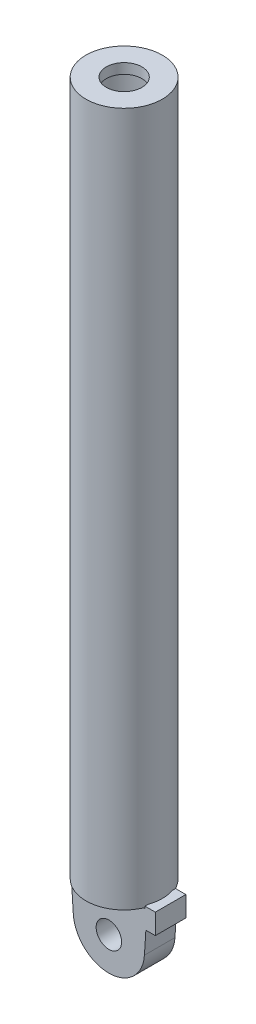
ISO-10303-21;
HEADER;
FILE_DESCRIPTION(('STEP AP214'),'2;1');
FILE_NAME('part.step','',(''),(''),'','','');
FILE_SCHEMA(('AUTOMOTIVE_DESIGN { 1 0 10303 214 1 1 1 1 }'));
ENDSEC;
DATA;
#1=APPLICATION_CONTEXT('core data for automotive mechanical design processes');
#2=APPLICATION_PROTOCOL_DEFINITION('international standard','automotive_design',2000,#1);
#3=PRODUCT_CONTEXT('',#1,'mechanical');
#4=PRODUCT('Part','Part','',(#3));
#5=PRODUCT_RELATED_PRODUCT_CATEGORY('part','',(#4));
#6=PRODUCT_DEFINITION_FORMATION('','',#4);
#7=PRODUCT_DEFINITION_CONTEXT('part definition',#1,'design');
#8=PRODUCT_DEFINITION('design','',#6,#7);
#9=PRODUCT_DEFINITION_SHAPE('','',#8);
#10=(LENGTH_UNIT() NAMED_UNIT(*) SI_UNIT(.MILLI.,.METRE.));
#11=(NAMED_UNIT(*) PLANE_ANGLE_UNIT() SI_UNIT($,.RADIAN.));
#12=(NAMED_UNIT(*) SI_UNIT($,.STERADIAN.) SOLID_ANGLE_UNIT());
#13=UNCERTAINTY_MEASURE_WITH_UNIT(LENGTH_MEASURE(1.E-05),#10,'distance_accuracy_value','');
#14=(GEOMETRIC_REPRESENTATION_CONTEXT(3) GLOBAL_UNCERTAINTY_ASSIGNED_CONTEXT((#13)) GLOBAL_UNIT_ASSIGNED_CONTEXT((#10,
#11,#12)) REPRESENTATION_CONTEXT('',''));
#15=CARTESIAN_POINT('',(0.,0.,0.));
#16=DIRECTION('',(0.,0.,1.));
#17=DIRECTION('',(1.,0.,0.));
#18=AXIS2_PLACEMENT_3D('',#15,#16,#17);
#19=CARTESIAN_POINT('',(35.5,42.,15.));
#20=DIRECTION('',(1.,0.,0.));
#21=DIRECTION('',(0.,0.,-1.));
#22=AXIS2_PLACEMENT_3D('',#19,#20,#21);
#23=PLANE('',#22);
#24=DIRECTION('',(0.,0.,-1.));
#25=VECTOR('',#24,1.);
#26=CARTESIAN_POINT('',(35.5,40.,15.));
#27=LINE('',#26,#25);
#28=CARTESIAN_POINT('',(35.5,40.,-12.0830459735943));
#29=VERTEX_POINT('',#28);
#30=CARTESIAN_POINT('',(35.5,40.,-15.));
#31=VERTEX_POINT('',#30);
#32=EDGE_CURVE('E170',#29,#31,#27,.T.);
#33=ORIENTED_EDGE('',*,*,#32,.F.);
#34=DIRECTION('',(0.,1.,0.));
#35=VECTOR('',#34,1.);
#36=CARTESIAN_POINT('',(35.5,722.,-12.083045973594));
#37=LINE('',#36,#35);
#38=CARTESIAN_POINT('',(35.5,42.,-12.0830459735943));
#39=VERTEX_POINT('',#38);
#40=EDGE_CURVE('E47',#29,#39,#37,.T.);
#41=ORIENTED_EDGE('',*,*,#40,.T.);
#42=DIRECTION('',(0.,0.,-1.));
#43=VECTOR('',#42,1.);
#44=CARTESIAN_POINT('',(35.5,42.,15.));
#45=LINE('',#44,#43);
#46=CARTESIAN_POINT('',(35.5,42.,-15.));
#47=VERTEX_POINT('',#46);
#48=EDGE_CURVE('E40',#39,#47,#45,.T.);
#49=ORIENTED_EDGE('',*,*,#48,.T.);
#50=DIRECTION('',(0.,-1.,0.));
#51=VECTOR('',#50,1.);
#52=CARTESIAN_POINT('',(35.5,42.,-15.));
#53=LINE('',#52,#51);
#54=EDGE_CURVE('E143',#47,#31,#53,.T.);
#55=ORIENTED_EDGE('',*,*,#54,.T.);
#56=EDGE_LOOP('',(#33,#41,#49,#55));
#57=FACE_BOUND('',#56,.T.);
#58=ADVANCED_FACE('F32',(#57),#23,.F.);
#59=CARTESIAN_POINT('',(-37.5,40.,15.));
#60=DIRECTION('',(0.,-1.,0.));
#61=DIRECTION('',(1.,0.,0.));
#62=AXIS2_PLACEMENT_3D('',#59,#60,#61);
#63=PLANE('',#62);
#64=CARTESIAN_POINT('',(35.5,40.,15.));
#65=VERTEX_POINT('',#64);
#66=CARTESIAN_POINT('',(35.5000000000001,40.,12.0830459735943));
#67=VERTEX_POINT('',#66);
#68=EDGE_CURVE('E171',#65,#67,#27,.T.);
#69=ORIENTED_EDGE('',*,*,#68,.T.);
#70=CARTESIAN_POINT('',(0.,40.,0.));
#71=DIRECTION('',(0.,1.,0.));
#72=DIRECTION('',(-1.,0.,0.));
#73=AXIS2_PLACEMENT_3D('',#70,#71,#72);
#74=CIRCLE('',#73,37.5);
#75=CARTESIAN_POINT('',(34.3693177121688,40.,15.));
#76=VERTEX_POINT('',#75);
#77=EDGE_CURVE('E251',#76,#67,#74,.T.);
#78=ORIENTED_EDGE('',*,*,#77,.F.);
#79=DIRECTION('',(-1.,0.,0.));
#80=VECTOR('',#79,1.);
#81=CARTESIAN_POINT('',(-37.5,40.,15.));
#82=LINE('',#81,#80);
#83=EDGE_CURVE('E224',#65,#76,#82,.T.);
#84=ORIENTED_EDGE('',*,*,#83,.F.);
#85=EDGE_LOOP('',(#69,#78,#84));
#86=FACE_BOUND('',#85,.T.);
#87=ADVANCED_FACE('F249',(#86),#63,.F.);
#88=CARTESIAN_POINT('',(-34.3693177121688,40.,15.));
#89=VERTEX_POINT('',#88);
#90=CARTESIAN_POINT('',(-37.5,40.,15.));
#91=VERTEX_POINT('',#90);
#92=EDGE_CURVE('E223',#89,#91,#82,.T.);
#93=ORIENTED_EDGE('',*,*,#92,.F.);
#94=CARTESIAN_POINT('',(-37.5,40.,0.));
#95=VERTEX_POINT('',#94);
#96=EDGE_CURVE('E256',#95,#89,#74,.T.);
#97=ORIENTED_EDGE('',*,*,#96,.F.);
#98=DIRECTION('',(0.,0.,-1.));
#99=VECTOR('',#98,1.);
#100=CARTESIAN_POINT('',(-37.5,40.,15.));
#101=LINE('',#100,#99);
#102=EDGE_CURVE('E168',#91,#95,#101,.T.);
#103=ORIENTED_EDGE('',*,*,#102,.F.);
#104=EDGE_LOOP('',(#93,#97,#103));
#105=FACE_BOUND('',#104,.T.);
#106=ADVANCED_FACE('F294',(#105),#63,.F.);
#107=CARTESIAN_POINT('',(-37.5,40.,-15.));
#108=VERTEX_POINT('',#107);
#109=EDGE_CURVE('E167',#95,#108,#101,.T.);
#110=ORIENTED_EDGE('',*,*,#109,.F.);
#111=CARTESIAN_POINT('',(-34.3693177121688,40.,-15.));
#112=VERTEX_POINT('',#111);
#113=EDGE_CURVE('E261',#112,#95,#74,.T.);
#114=ORIENTED_EDGE('',*,*,#113,.F.);
#115=DIRECTION('',(-1.,0.,0.));
#116=VECTOR('',#115,1.);
#117=CARTESIAN_POINT('',(-37.5,40.,-15.));
#118=LINE('',#117,#116);
#119=EDGE_CURVE('E147',#112,#108,#118,.T.);
#120=ORIENTED_EDGE('',*,*,#119,.T.);
#121=EDGE_LOOP('',(#110,#114,#120));
#122=FACE_BOUND('',#121,.T.);
#123=ADVANCED_FACE('F301',(#122),#63,.F.);
#124=CARTESIAN_POINT('',(0.,2.24598177316563,15.));
#125=DIRECTION('',(0.,0.,1.));
#126=DIRECTION('',(1.,0.,0.));
#127=AXIS2_PLACEMENT_3D('',#124,#125,#126);
#128=PLANE('',#127);
#129=DIRECTION('',(-1.,0.,0.));
#130=VECTOR('',#129,1.);
#131=CARTESIAN_POINT('',(37.628606884265,42.,15.));
#132=LINE('',#131,#130);
#133=CARTESIAN_POINT('',(45.628606884265,42.,15.));
#134=VERTEX_POINT('',#133);
#135=CARTESIAN_POINT('',(35.5,42.,15.));
#136=VERTEX_POINT('',#135);
#137=EDGE_CURVE('E96',#134,#136,#132,.T.);
#138=ORIENTED_EDGE('',*,*,#137,.T.);
#139=DIRECTION('',(0.,-1.,0.));
#140=VECTOR('',#139,1.);
#141=CARTESIAN_POINT('',(35.5,42.,15.));
#142=LINE('',#141,#140);
#143=EDGE_CURVE('E221',#136,#65,#142,.T.);
#144=ORIENTED_EDGE('',*,*,#143,.T.);
#145=ORIENTED_EDGE('',*,*,#83,.T.);
#146=DIRECTION('',(1.,0.,0.));
#147=VECTOR('',#146,1.);
#148=CARTESIAN_POINT('',(0.,40.,15.));
#149=LINE('',#148,#147);
#150=EDGE_CURVE('E198',#89,#76,#149,.T.);
#151=ORIENTED_EDGE('',*,*,#150,.F.);
#152=ORIENTED_EDGE('',*,*,#92,.T.);
#153=DIRECTION('',(0.064170907804732,-0.99793892327713,0.));
#154=VECTOR('',#153,1.);
#155=CARTESIAN_POINT('',(-37.5,40.,15.));
#156=LINE('',#155,#154);
#157=CARTESIAN_POINT('',(-34.9278623146995,0.,15.));
#158=VERTEX_POINT('',#157);
#159=EDGE_CURVE('E227',#91,#158,#156,.T.);
#160=ORIENTED_EDGE('',*,*,#159,.T.);
#161=CARTESIAN_POINT('',(0.,2.24598177316563,15.));
#162=DIRECTION('',(0.,0.,1.));
#163=DIRECTION('',(1.,0.,0.));
#164=AXIS2_PLACEMENT_3D('',#161,#162,#163);
#165=CIRCLE('',#164,35.);
#166=CARTESIAN_POINT('',(34.9278623146995,0.,15.));
#167=VERTEX_POINT('',#166);
#168=EDGE_CURVE('E120',#158,#167,#165,.T.);
#169=ORIENTED_EDGE('',*,*,#168,.T.);
#170=DIRECTION('',(0.0641709078047325,0.99793892327713,0.));
#171=VECTOR('',#170,1.);
#172=CARTESIAN_POINT('',(36.3425380416148,22.,15.));
#173=LINE('',#172,#171);
#174=CARTESIAN_POINT('',(36.3425380416148,22.,15.));
#175=VERTEX_POINT('',#174);
#176=EDGE_CURVE('E112',#167,#175,#173,.T.);
#177=ORIENTED_EDGE('',*,*,#176,.T.);
#178=DIRECTION('',(1.,0.,0.));
#179=VECTOR('',#178,1.);
#180=CARTESIAN_POINT('',(45.628606884265,22.,15.));
#181=LINE('',#180,#179);
#182=CARTESIAN_POINT('',(45.628606884265,22.,15.));
#183=VERTEX_POINT('',#182);
#184=EDGE_CURVE('E117',#175,#183,#181,.T.);
#185=ORIENTED_EDGE('',*,*,#184,.T.);
#186=DIRECTION('',(0.,1.,0.));
#187=VECTOR('',#186,1.);
#188=CARTESIAN_POINT('',(45.628606884265,42.,15.));
#189=LINE('',#188,#187);
#190=EDGE_CURVE('E56',#183,#134,#189,.T.);
#191=ORIENTED_EDGE('',*,*,#190,.T.);
#192=EDGE_LOOP('',(#138,#144,#145,#151,#152,#160,#169,#177,#185,#191));
#193=FACE_BOUND('',#192,.T.);
#194=CARTESIAN_POINT('',(0.,0.,15.));
#195=DIRECTION('',(0.,0.,1.));
#196=DIRECTION('',(1.,0.,0.));
#197=AXIS2_PLACEMENT_3D('',#194,#195,#196);
#198=CIRCLE('',#197,12.5);
#199=CARTESIAN_POINT('',(12.5,0.,15.));
#200=VERTEX_POINT('',#199);
#201=EDGE_CURVE('E144',#200,#200,#198,.T.);
#202=ORIENTED_EDGE('',*,*,#201,.F.);
#203=EDGE_LOOP('',(#202));
#204=FACE_BOUND('',#203,.T.);
#205=ADVANCED_FACE('F114',(#193,#204),#128,.T.);
#206=CARTESIAN_POINT('',(0.,2.24598177316563,-15.));
#207=DIRECTION('',(0.,0.,1.));
#208=DIRECTION('',(1.,0.,0.));
#209=AXIS2_PLACEMENT_3D('',#206,#207,#208);
#210=PLANE('',#209);
#211=DIRECTION('',(-1.,0.,0.));
#212=VECTOR('',#211,1.);
#213=CARTESIAN_POINT('',(37.628606884265,42.,-15.));
#214=LINE('',#213,#212);
#215=CARTESIAN_POINT('',(45.628606884265,42.,-15.));
#216=VERTEX_POINT('',#215);
#217=EDGE_CURVE('E90',#216,#47,#214,.T.);
#218=ORIENTED_EDGE('',*,*,#217,.F.);
#219=DIRECTION('',(0.,1.,0.));
#220=VECTOR('',#219,1.);
#221=CARTESIAN_POINT('',(45.628606884265,42.,-15.));
#222=LINE('',#221,#220);
#223=CARTESIAN_POINT('',(45.628606884265,22.,-15.));
#224=VERTEX_POINT('',#223);
#225=EDGE_CURVE('E158',#224,#216,#222,.T.);
#226=ORIENTED_EDGE('',*,*,#225,.F.);
#227=DIRECTION('',(1.,0.,0.));
#228=VECTOR('',#227,1.);
#229=CARTESIAN_POINT('',(45.628606884265,22.,-15.));
#230=LINE('',#229,#228);
#231=CARTESIAN_POINT('',(36.3425380416148,22.,-15.));
#232=VERTEX_POINT('',#231);
#233=EDGE_CURVE('E156',#232,#224,#230,.T.);
#234=ORIENTED_EDGE('',*,*,#233,.F.);
#235=DIRECTION('',(0.0641709078047325,0.99793892327713,0.));
#236=VECTOR('',#235,1.);
#237=CARTESIAN_POINT('',(36.3425380416148,22.,-15.));
#238=LINE('',#237,#236);
#239=CARTESIAN_POINT('',(34.9278623146995,0.,-15.));
#240=VERTEX_POINT('',#239);
#241=EDGE_CURVE('E129',#240,#232,#238,.T.);
#242=ORIENTED_EDGE('',*,*,#241,.F.);
#243=CARTESIAN_POINT('',(0.,2.24598177316563,-15.));
#244=DIRECTION('',(0.,0.,1.));
#245=DIRECTION('',(1.,0.,0.));
#246=AXIS2_PLACEMENT_3D('',#243,#244,#245);
#247=CIRCLE('',#246,35.);
#248=CARTESIAN_POINT('',(-34.9278623146995,0.,-15.));
#249=VERTEX_POINT('',#248);
#250=EDGE_CURVE('E153',#249,#240,#247,.T.);
#251=ORIENTED_EDGE('',*,*,#250,.F.);
#252=DIRECTION('',(0.064170907804732,-0.99793892327713,0.));
#253=VECTOR('',#252,1.);
#254=CARTESIAN_POINT('',(-37.5,40.,-15.));
#255=LINE('',#254,#253);
#256=EDGE_CURVE('E151',#108,#249,#255,.T.);
#257=ORIENTED_EDGE('',*,*,#256,.F.);
#258=ORIENTED_EDGE('',*,*,#119,.F.);
#259=DIRECTION('',(1.,0.,0.));
#260=VECTOR('',#259,1.);
#261=CARTESIAN_POINT('',(0.,40.,-15.));
#262=LINE('',#261,#260);
#263=CARTESIAN_POINT('',(34.3693177121688,40.,-15.));
#264=VERTEX_POINT('',#263);
#265=EDGE_CURVE('E191',#112,#264,#262,.T.);
#266=ORIENTED_EDGE('',*,*,#265,.T.);
#267=EDGE_CURVE('E148',#31,#264,#118,.T.);
#268=ORIENTED_EDGE('',*,*,#267,.F.);
#269=ORIENTED_EDGE('',*,*,#54,.F.);
#270=EDGE_LOOP('',(#218,#226,#234,#242,#251,#257,#258,#266,#268,#269));
#271=FACE_BOUND('',#270,.T.);
#272=CARTESIAN_POINT('',(0.,0.,-15.));
#273=DIRECTION('',(0.,0.,1.));
#274=DIRECTION('',(1.,0.,0.));
#275=AXIS2_PLACEMENT_3D('',#272,#273,#274);
#276=CIRCLE('',#275,12.5);
#277=CARTESIAN_POINT('',(12.5,0.,-15.));
#278=VERTEX_POINT('',#277);
#279=EDGE_CURVE('E215',#278,#278,#276,.T.);
#280=ORIENTED_EDGE('',*,*,#279,.T.);
#281=EDGE_LOOP('',(#280));
#282=FACE_BOUND('',#281,.T.);
#283=ADVANCED_FACE('F187',(#271,#282),#210,.F.);
#284=CARTESIAN_POINT('',(37.628606884265,42.,15.));
#285=DIRECTION('',(0.,-1.,0.));
#286=DIRECTION('',(0.,0.,-1.));
#287=AXIS2_PLACEMENT_3D('',#284,#285,#286);
#288=PLANE('',#287);
#289=ORIENTED_EDGE('',*,*,#48,.F.);
#290=CARTESIAN_POINT('',(0.,42.,0.));
#291=DIRECTION('',(0.,-1.,0.));
#292=DIRECTION('',(0.,0.,-1.));
#293=AXIS2_PLACEMENT_3D('',#290,#291,#292);
#294=CIRCLE('',#293,37.4999999999999);
#295=CARTESIAN_POINT('',(35.5000000000001,41.9999999999999,12.083045973594));
#296=VERTEX_POINT('',#295);
#297=EDGE_CURVE('E211',#39,#296,#294,.T.);
#298=ORIENTED_EDGE('',*,*,#297,.T.);
#299=EDGE_CURVE('E11',#136,#296,#45,.T.);
#300=ORIENTED_EDGE('',*,*,#299,.F.);
#301=ORIENTED_EDGE('',*,*,#137,.F.);
#302=DIRECTION('',(0.,0.,-1.));
#303=VECTOR('',#302,1.);
#304=CARTESIAN_POINT('',(45.628606884265,42.,15.));
#305=LINE('',#304,#303);
#306=EDGE_CURVE('E138',#134,#216,#305,.T.);
#307=ORIENTED_EDGE('',*,*,#306,.T.);
#308=ORIENTED_EDGE('',*,*,#217,.T.);
#309=EDGE_LOOP('',(#289,#298,#300,#301,#307,#308));
#310=FACE_BOUND('',#309,.T.);
#311=ADVANCED_FACE('F34',(#310),#288,.F.);
#312=ORIENTED_EDGE('',*,*,#299,.T.);
#313=DIRECTION('',(0.,1.,0.));
#314=VECTOR('',#313,1.);
#315=CARTESIAN_POINT('',(35.5,722.,12.083045973594));
#316=LINE('',#315,#314);
#317=EDGE_CURVE('E202',#296,#67,#316,.F.);
#318=ORIENTED_EDGE('',*,*,#317,.T.);
#319=ORIENTED_EDGE('',*,*,#68,.F.);
#320=ORIENTED_EDGE('',*,*,#143,.F.);
#321=EDGE_LOOP('',(#312,#318,#319,#320));
#322=FACE_BOUND('',#321,.T.);
#323=ADVANCED_FACE('F245',(#322),#23,.F.);
#324=ORIENTED_EDGE('',*,*,#267,.T.);
#325=EDGE_CURVE('E183',#29,#264,#74,.T.);
#326=ORIENTED_EDGE('',*,*,#325,.F.);
#327=ORIENTED_EDGE('',*,*,#32,.T.);
#328=EDGE_LOOP('',(#324,#326,#327));
#329=FACE_BOUND('',#328,.T.);
#330=ADVANCED_FACE('F180',(#329),#63,.F.);
#331=CARTESIAN_POINT('',(-37.5,40.,15.));
#332=DIRECTION('',(0.99793892327713,0.064170907804732,0.));
#333=DIRECTION('',(-0.064170907804732,0.99793892327713,0.));
#334=AXIS2_PLACEMENT_3D('',#331,#332,#333);
#335=PLANE('',#334);
#336=ORIENTED_EDGE('',*,*,#256,.T.);
#337=DIRECTION('',(0.,0.,-1.));
#338=VECTOR('',#337,1.);
#339=CARTESIAN_POINT('',(-34.9278623146995,0.,15.));
#340=LINE('',#339,#338);
#341=EDGE_CURVE('E164',#158,#249,#340,.T.);
#342=ORIENTED_EDGE('',*,*,#341,.F.);
#343=ORIENTED_EDGE('',*,*,#159,.F.);
#344=ORIENTED_EDGE('',*,*,#102,.T.);
#345=ORIENTED_EDGE('',*,*,#109,.T.);
#346=EDGE_LOOP('',(#336,#342,#343,#344,#345));
#347=FACE_BOUND('',#346,.T.);
#348=ADVANCED_FACE('F234',(#347),#335,.F.);
#349=CARTESIAN_POINT('',(0.,2.24598177316563,15.));
#350=DIRECTION('',(0.,0.,-1.));
#351=DIRECTION('',(-1.,0.,0.));
#352=AXIS2_PLACEMENT_3D('',#349,#350,#351);
#353=CYLINDRICAL_SURFACE('',#352,35.);
#354=ORIENTED_EDGE('',*,*,#250,.T.);
#355=DIRECTION('',(0.,0.,-1.));
#356=VECTOR('',#355,1.);
#357=CARTESIAN_POINT('',(34.9278623146995,0.,15.));
#358=LINE('',#357,#356);
#359=EDGE_CURVE('E132',#167,#240,#358,.T.);
#360=ORIENTED_EDGE('',*,*,#359,.F.);
#361=ORIENTED_EDGE('',*,*,#168,.F.);
#362=ORIENTED_EDGE('',*,*,#341,.T.);
#363=EDGE_LOOP('',(#354,#360,#361,#362));
#364=FACE_BOUND('',#363,.T.);
#365=ADVANCED_FACE('F238',(#364),#353,.T.);
#366=CARTESIAN_POINT('',(36.3425380416148,22.,15.));
#367=DIRECTION('',(-0.99793892327713,0.0641709078047325,0.));
#368=DIRECTION('',(-0.0641709078047325,-0.99793892327713,0.));
#369=AXIS2_PLACEMENT_3D('',#366,#367,#368);
#370=PLANE('',#369);
#371=ORIENTED_EDGE('',*,*,#241,.T.);
#372=DIRECTION('',(0.,0.,-1.));
#373=VECTOR('',#372,1.);
#374=CARTESIAN_POINT('',(36.3425380416148,22.,15.));
#375=LINE('',#374,#373);
#376=EDGE_CURVE('E126',#175,#232,#375,.T.);
#377=ORIENTED_EDGE('',*,*,#376,.F.);
#378=ORIENTED_EDGE('',*,*,#176,.F.);
#379=ORIENTED_EDGE('',*,*,#359,.T.);
#380=EDGE_LOOP('',(#371,#377,#378,#379));
#381=FACE_BOUND('',#380,.T.);
#382=ADVANCED_FACE('F127',(#381),#370,.F.);
#383=CARTESIAN_POINT('',(45.628606884265,22.,15.));
#384=DIRECTION('',(0.,1.,0.));
#385=DIRECTION('',(0.,0.,1.));
#386=AXIS2_PLACEMENT_3D('',#383,#384,#385);
#387=PLANE('',#386);
#388=ORIENTED_EDGE('',*,*,#233,.T.);
#389=DIRECTION('',(0.,0.,-1.));
#390=VECTOR('',#389,1.);
#391=CARTESIAN_POINT('',(45.628606884265,22.,15.));
#392=LINE('',#391,#390);
#393=EDGE_CURVE('E133',#183,#224,#392,.T.);
#394=ORIENTED_EDGE('',*,*,#393,.F.);
#395=ORIENTED_EDGE('',*,*,#184,.F.);
#396=ORIENTED_EDGE('',*,*,#376,.T.);
#397=EDGE_LOOP('',(#388,#394,#395,#396));
#398=FACE_BOUND('',#397,.T.);
#399=ADVANCED_FACE('F135',(#398),#387,.F.);
#400=CARTESIAN_POINT('',(45.628606884265,42.,15.));
#401=DIRECTION('',(-1.,0.,0.));
#402=DIRECTION('',(0.,0.,1.));
#403=AXIS2_PLACEMENT_3D('',#400,#401,#402);
#404=PLANE('',#403);
#405=ORIENTED_EDGE('',*,*,#225,.T.);
#406=ORIENTED_EDGE('',*,*,#306,.F.);
#407=ORIENTED_EDGE('',*,*,#190,.F.);
#408=ORIENTED_EDGE('',*,*,#393,.T.);
#409=EDGE_LOOP('',(#405,#406,#407,#408));
#410=FACE_BOUND('',#409,.T.);
#411=ADVANCED_FACE('F240',(#410),#404,.F.);
#412=CARTESIAN_POINT('',(0.,0.,15.));
#413=DIRECTION('',(0.,0.,-1.));
#414=DIRECTION('',(-1.,0.,0.));
#415=AXIS2_PLACEMENT_3D('',#412,#413,#414);
#416=CYLINDRICAL_SURFACE('',#415,12.5);
#417=ORIENTED_EDGE('',*,*,#201,.T.);
#418=EDGE_LOOP('',(#417));
#419=FACE_BOUND('',#418,.T.);
#420=ORIENTED_EDGE('',*,*,#279,.F.);
#421=EDGE_LOOP('',(#420));
#422=FACE_BOUND('',#421,.T.);
#423=ADVANCED_FACE('F314',(#419,#422),#416,.F.);
#424=CARTESIAN_POINT('',(0.,722.,0.));
#425=DIRECTION('',(0.,1.,0.));
#426=DIRECTION('',(-1.,0.,0.));
#427=AXIS2_PLACEMENT_3D('',#424,#425,#426);
#428=CYLINDRICAL_SURFACE('',#427,37.4999999999999);
#429=CARTESIAN_POINT('',(0.,722.,0.));
#430=DIRECTION('',(0.,1.,0.));
#431=DIRECTION('',(-1.,0.,0.));
#432=AXIS2_PLACEMENT_3D('',#429,#430,#431);
#433=CIRCLE('',#432,37.4999999999998);
#434=CARTESIAN_POINT('',(-37.4999999999999,722.,0.));
#435=VERTEX_POINT('',#434);
#436=EDGE_CURVE('E199',#435,#435,#433,.T.);
#437=ORIENTED_EDGE('',*,*,#436,.F.);
#438=EDGE_LOOP('',(#437));
#439=FACE_BOUND('',#438,.T.);
#440=ORIENTED_EDGE('',*,*,#40,.F.);
#441=ORIENTED_EDGE('',*,*,#325,.T.);
#442=EDGE_CURVE('E257',#264,#112,#74,.T.);
#443=ORIENTED_EDGE('',*,*,#442,.T.);
#444=ORIENTED_EDGE('',*,*,#113,.T.);
#445=ORIENTED_EDGE('',*,*,#96,.T.);
#446=EDGE_CURVE('E254',#89,#76,#74,.T.);
#447=ORIENTED_EDGE('',*,*,#446,.T.);
#448=ORIENTED_EDGE('',*,*,#77,.T.);
#449=ORIENTED_EDGE('',*,*,#317,.F.);
#450=ORIENTED_EDGE('',*,*,#297,.F.);
#451=EDGE_LOOP('',(#440,#441,#443,#444,#445,#447,#448,#449,#450));
#452=FACE_BOUND('',#451,.T.);
#453=ADVANCED_FACE('F349',(#439,#452),#428,.T.);
#454=CARTESIAN_POINT('',(0.,40.,0.));
#455=DIRECTION('',(0.,-1.,0.));
#456=DIRECTION('',(1.,0.,0.));
#457=AXIS2_PLACEMENT_3D('',#454,#455,#456);
#458=PLANE('',#457);
#459=ORIENTED_EDGE('',*,*,#265,.F.);
#460=ORIENTED_EDGE('',*,*,#442,.F.);
#461=EDGE_LOOP('',(#459,#460));
#462=FACE_BOUND('',#461,.T.);
#463=ADVANCED_FACE('F286',(#462),#458,.T.);
#464=ORIENTED_EDGE('',*,*,#446,.F.);
#465=ORIENTED_EDGE('',*,*,#150,.T.);
#466=EDGE_LOOP('',(#464,#465));
#467=FACE_BOUND('',#466,.T.);
#468=ADVANCED_FACE('F277',(#467),#458,.T.);
#469=CARTESIAN_POINT('',(-37.4999999999999,722.,0.));
#470=DIRECTION('',(0.,1.,0.));
#471=DIRECTION('',(-1.,0.,0.));
#472=AXIS2_PLACEMENT_3D('',#469,#470,#471);
#473=PLANE('',#472);
#474=ORIENTED_EDGE('',*,*,#436,.T.);
#475=EDGE_LOOP('',(#474));
#476=FACE_BOUND('',#475,.T.);
#477=CARTESIAN_POINT('',(0.,722.,0.));
#478=DIRECTION('',(0.,1.,0.));
#479=DIRECTION('',(-1.,0.,0.));
#480=AXIS2_PLACEMENT_3D('',#477,#478,#479);
#481=CIRCLE('',#480,17.5);
#482=CARTESIAN_POINT('',(-17.5000000000001,722.,0.));
#483=VERTEX_POINT('',#482);
#484=EDGE_CURVE('E205',#483,#483,#481,.T.);
#485=ORIENTED_EDGE('',*,*,#484,.F.);
#486=EDGE_LOOP('',(#485));
#487=FACE_BOUND('',#486,.T.);
#488=ADVANCED_FACE('F275',(#476,#487),#473,.T.);
#489=CARTESIAN_POINT('',(0.,722.,0.));
#490=DIRECTION('',(0.,1.,0.));
#491=DIRECTION('',(-1.,0.,0.));
#492=AXIS2_PLACEMENT_3D('',#489,#490,#491);
#493=CYLINDRICAL_SURFACE('',#492,17.5);
#494=ORIENTED_EDGE('',*,*,#484,.T.);
#495=EDGE_LOOP('',(#494));
#496=FACE_BOUND('',#495,.T.);
#497=CARTESIAN_POINT('',(0.,712.,0.));
#498=DIRECTION('',(0.,1.,0.));
#499=DIRECTION('',(-1.,0.,0.));
#500=AXIS2_PLACEMENT_3D('',#497,#498,#499);
#501=CIRCLE('',#500,17.5);
#502=CARTESIAN_POINT('',(-17.5000000000001,712.,0.));
#503=VERTEX_POINT('',#502);
#504=EDGE_CURVE('E267',#503,#503,#501,.T.);
#505=ORIENTED_EDGE('',*,*,#504,.F.);
#506=EDGE_LOOP('',(#505));
#507=FACE_BOUND('',#506,.T.);
#508=ADVANCED_FACE('F272',(#496,#507),#493,.F.);
#509=CARTESIAN_POINT('',(-17.5000000000001,712.,0.));
#510=DIRECTION('',(0.,-1.,0.));
#511=DIRECTION('',(1.,0.,0.));
#512=AXIS2_PLACEMENT_3D('',#509,#510,#511);
#513=PLANE('',#512);
#514=ORIENTED_EDGE('',*,*,#504,.T.);
#515=EDGE_LOOP('',(#514));
#516=FACE_BOUND('',#515,.T.);
#517=CARTESIAN_POINT('',(0.,712.,0.));
#518=DIRECTION('',(0.,1.,0.));
#519=DIRECTION('',(-1.,0.,0.));
#520=AXIS2_PLACEMENT_3D('',#517,#518,#519);
#521=CIRCLE('',#520,32.4999999999999);
#522=CARTESIAN_POINT('',(-32.5,712.,0.));
#523=VERTEX_POINT('',#522);
#524=EDGE_CURVE('E264',#523,#523,#521,.T.);
#525=ORIENTED_EDGE('',*,*,#524,.F.);
#526=EDGE_LOOP('',(#525));
#527=FACE_BOUND('',#526,.T.);
#528=ADVANCED_FACE('F284',(#516,#527),#513,.T.);
#529=CARTESIAN_POINT('',(0.,722.,0.));
#530=DIRECTION('',(0.,1.,0.));
#531=DIRECTION('',(-1.,0.,0.));
#532=AXIS2_PLACEMENT_3D('',#529,#530,#531);
#533=CYLINDRICAL_SURFACE('',#532,32.4999999999999);
#534=ORIENTED_EDGE('',*,*,#524,.T.);
#535=EDGE_LOOP('',(#534));
#536=FACE_BOUND('',#535,.T.);
#537=CARTESIAN_POINT('',(0.,172.,0.));
#538=DIRECTION('',(0.,1.,0.));
#539=DIRECTION('',(-1.,0.,0.));
#540=AXIS2_PLACEMENT_3D('',#537,#538,#539);
#541=CIRCLE('',#540,32.4999999999999);
#542=CARTESIAN_POINT('',(-32.4999999999999,172.,0.));
#543=VERTEX_POINT('',#542);
#544=EDGE_CURVE('E260',#543,#543,#541,.T.);
#545=ORIENTED_EDGE('',*,*,#544,.F.);
#546=EDGE_LOOP('',(#545));
#547=FACE_BOUND('',#546,.T.);
#548=ADVANCED_FACE('F383',(#536,#547),#533,.F.);
#549=CARTESIAN_POINT('',(-32.4999999999999,172.,0.));
#550=DIRECTION('',(0.,1.,0.));
#551=DIRECTION('',(-1.,0.,0.));
#552=AXIS2_PLACEMENT_3D('',#549,#550,#551);
#553=PLANE('',#552);
#554=ORIENTED_EDGE('',*,*,#544,.T.);
#555=EDGE_LOOP('',(#554));
#556=FACE_BOUND('',#555,.T.);
#557=ADVANCED_FACE('F393',(#556),#553,.T.);
#558=CLOSED_SHELL('',(#58,#87,#106,#123,#205,#283,#311,#323,#330,#348,#365,#382,#399,#411,#423,
#453,#463,#468,#488,#508,#528,#548,#557));
#559=MANIFOLD_SOLID_BREP('B2',#558);
#560=ADVANCED_BREP_SHAPE_REPRESENTATION('',(#18,#559),#14);
#561=SHAPE_DEFINITION_REPRESENTATION(#9,#560);
ENDSEC;
END-ISO-10303-21;
